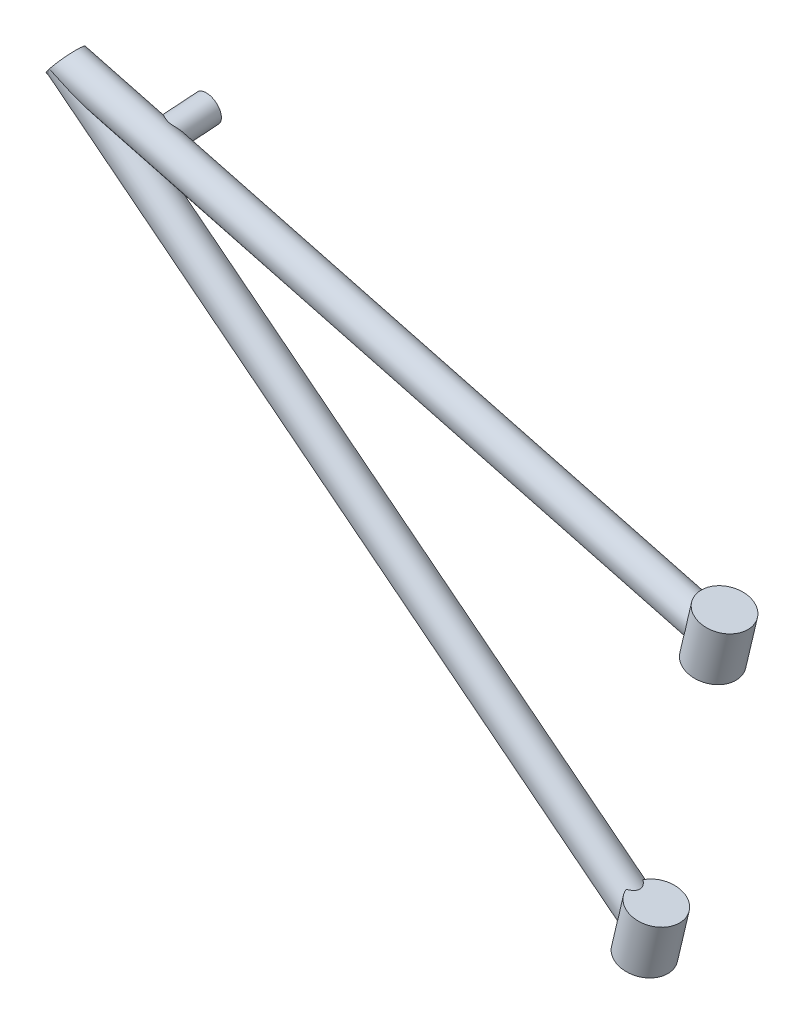
ISO-10303-21;
HEADER;
FILE_DESCRIPTION(('STEP AP214'),'2;1');
FILE_NAME('part.step','',(''),(''),'','','');
FILE_SCHEMA(('AUTOMOTIVE_DESIGN { 1 0 10303 214 1 1 1 1 }'));
ENDSEC;
DATA;
#1=APPLICATION_CONTEXT('core data for automotive mechanical design processes');
#2=APPLICATION_PROTOCOL_DEFINITION('international standard','automotive_design',2000,#1);
#3=PRODUCT_CONTEXT('',#1,'mechanical');
#4=PRODUCT('Part','Part','',(#3));
#5=PRODUCT_RELATED_PRODUCT_CATEGORY('part','',(#4));
#6=PRODUCT_DEFINITION_FORMATION('','',#4);
#7=PRODUCT_DEFINITION_CONTEXT('part definition',#1,'design');
#8=PRODUCT_DEFINITION('design','',#6,#7);
#9=PRODUCT_DEFINITION_SHAPE('','',#8);
#10=(LENGTH_UNIT() NAMED_UNIT(*) SI_UNIT(.MILLI.,.METRE.));
#11=(NAMED_UNIT(*) PLANE_ANGLE_UNIT() SI_UNIT($,.RADIAN.));
#12=(NAMED_UNIT(*) SI_UNIT($,.STERADIAN.) SOLID_ANGLE_UNIT());
#13=UNCERTAINTY_MEASURE_WITH_UNIT(LENGTH_MEASURE(1.E-05),#10,'distance_accuracy_value','');
#14=(GEOMETRIC_REPRESENTATION_CONTEXT(3) GLOBAL_UNCERTAINTY_ASSIGNED_CONTEXT((#13)) GLOBAL_UNIT_ASSIGNED_CONTEXT((#10,
#11,#12)) REPRESENTATION_CONTEXT('',''));
#15=CARTESIAN_POINT('',(0.,0.,0.));
#16=DIRECTION('',(0.,0.,1.));
#17=DIRECTION('',(1.,0.,0.));
#18=AXIS2_PLACEMENT_3D('',#15,#16,#17);
#19=CARTESIAN_POINT('',(-215.,1151.6011,-53.649));
#20=DIRECTION('',(-0.788508643665139,0.615015858971912,-0.00310033520835739));
#21=DIRECTION('',(-0.615018814783549,-0.788512433295911,0.));
#22=AXIS2_PLACEMENT_3D('',#19,#20,#21);
#23=CYLINDRICAL_SURFACE('',#22,9.525);
#24=CARTESIAN_POINT('',(-243.39562055654,1173.74893199642,-53.7606486710474));
#25=DIRECTION('',(0.230684760062267,0.973028498209276,0.000288353283411398));
#26=DIRECTION('',(-0.973022198051878,0.230684316193179,-0.00354236655039736));
#27=AXIS2_PLACEMENT_3D('',#24,#25,#26);
#28=ELLIPSE('',#27,22.8674930535986,9.525);
#29=CARTESIAN_POINT('',(-224.286262085042,1169.21993073521,-58.5827833271125));
#30=VERTEX_POINT('',#29);
#31=CARTESIAN_POINT('',(-224.320634321341,1169.225180437,-48.7995007985225));
#32=VERTEX_POINT('',#31);
#33=EDGE_CURVE('E105',#30,#32,#28,.F.);
#34=ORIENTED_EDGE('',*,*,#33,.F.);
#35=CARTESIAN_POINT('',(-224.320634321341,1169.225180437,-48.7995007985225));
#36=CARTESIAN_POINT('',(-224.295289207423,1169.09059523989,-48.6485355594731));
#37=CARTESIAN_POINT('',(-224.269502594691,1168.95160987775,-48.5016369115154));
#38=CARTESIAN_POINT('',(-224.217460516379,1168.66584174725,-48.2158483730908));
#39=CARTESIAN_POINT('',(-224.191205277724,1168.51906268832,-48.0769547371071));
#40=CARTESIAN_POINT('',(-224.138667081962,1168.21887651433,-47.8071750004393));
#41=CARTESIAN_POINT('',(-224.112384280659,1168.06548298792,-47.6762737035536));
#42=CARTESIAN_POINT('',(-224.060117173359,1167.75254967428,-47.4219621247782));
#43=CARTESIAN_POINT('',(-224.034132907183,1167.59300907918,-47.298552833037));
#44=CARTESIAN_POINT('',(-223.957136973827,1167.10586534488,-46.9390216085571));
#45=CARTESIAN_POINT('',(-223.907125055243,1166.76998067498,-46.713809774104));
#46=CARTESIAN_POINT('',(-223.81276926608,1166.08036007492,-46.2910710180656));
#47=CARTESIAN_POINT('',(-223.768428441769,1165.72661469185,-46.0935589701565));
#48=CARTESIAN_POINT('',(-223.692482337151,1165.03900047878,-45.7430462401006));
#49=CARTESIAN_POINT('',(-223.660064521758,1164.70646741956,-45.5875949874824));
#50=CARTESIAN_POINT('',(-223.605247829181,1164.03125571281,-45.2985848887143));
#51=CARTESIAN_POINT('',(-223.582847710299,1163.68857832828,-45.1650233306261));
#52=CARTESIAN_POINT('',(-223.551264109419,1162.99483116172,-44.9203286610457));
#53=CARTESIAN_POINT('',(-223.542073917122,1162.64376573279,-44.8091841869413));
#54=CARTESIAN_POINT('',(-223.540654640744,1161.93511851939,-44.6105914566239));
#55=CARTESIAN_POINT('',(-223.548419527181,1161.57753909623,-44.5231347890997));
#56=CARTESIAN_POINT('',(-223.591728976539,1160.73355915383,-44.3483048364498));
#57=CARTESIAN_POINT('',(-223.635922136758,1160.2452175784,-44.2713397563707));
#58=CARTESIAN_POINT('',(-223.739698948793,1159.51439261035,-44.1973134032289));
#59=CARTESIAN_POINT('',(-223.780506030959,1159.27120005024,-44.1795398917238));
#60=CARTESIAN_POINT('',(-223.875854045727,1158.78678991507,-44.1590549988136));
#61=CARTESIAN_POINT('',(-223.930395042434,1158.54557234923,-44.1563436877163));
#62=CARTESIAN_POINT('',(-224.054871038112,1158.06405215677,-44.1673837542468));
#63=CARTESIAN_POINT('',(-224.12500107534,1157.82380433931,-44.181354500947));
#64=CARTESIAN_POINT('',(-224.280401330248,1157.34999089194,-44.2273617054836));
#65=CARTESIAN_POINT('',(-224.365670871451,1157.11642496401,-44.2593973562663));
#66=CARTESIAN_POINT('',(-224.550567614918,1156.65864283163,-44.3423936701185));
#67=CARTESIAN_POINT('',(-224.650187433858,1156.43442189516,-44.3933446222576));
#68=CARTESIAN_POINT('',(-224.86212569037,1155.99750936304,-44.5145483765032));
#69=CARTESIAN_POINT('',(-224.974442851189,1155.78481661139,-44.5847992389658));
#70=CARTESIAN_POINT('',(-225.191087424431,1155.40463409945,-44.7320466579948));
#71=CARTESIAN_POINT('',(-225.293959076843,1155.23524453879,-44.80631437343));
#72=CARTESIAN_POINT('',(-225.50528074953,1154.9065164519,-44.9681794158287));
#73=CARTESIAN_POINT('',(-225.613732938815,1154.74718188818,-45.0557819519947));
#74=CARTESIAN_POINT('',(-225.834357534689,1154.43893292305,-45.2438062320331));
#75=CARTESIAN_POINT('',(-225.946531105204,1154.29002182791,-45.3442320151155));
#76=CARTESIAN_POINT('',(-226.172751379729,1154.00271207689,-45.5572829491347));
#77=CARTESIAN_POINT('',(-226.286798308782,1153.8643146954,-45.6699095749595));
#78=CARTESIAN_POINT('',(-226.521059223594,1153.59087193904,-45.912967181198));
#79=CARTESIAN_POINT('',(-226.641280572878,1153.45639033468,-46.0440245602015));
#80=CARTESIAN_POINT('',(-226.880011711337,1153.19866386453,-46.3181683650363));
#81=CARTESIAN_POINT('',(-226.998521482131,1153.07541911934,-46.4612549199345));
#82=CARTESIAN_POINT('',(-227.232179016608,1152.8397918452,-46.7587406524558));
#83=CARTESIAN_POINT('',(-227.347325968949,1152.72741192273,-46.9131425290829));
#84=CARTESIAN_POINT('',(-227.57271586912,1152.51320348435,-47.2324871004078));
#85=CARTESIAN_POINT('',(-227.682958494457,1152.41137566175,-47.3974304865487));
#86=CARTESIAN_POINT('',(-227.91478883551,1152.2020582696,-47.7650609369957));
#87=CARTESIAN_POINT('',(-228.035261038146,1152.0963912512,-47.9694943631884));
#88=CARTESIAN_POINT('',(-228.265752160391,1151.89856614401,-48.3904502736869));
#89=CARTESIAN_POINT('',(-228.375770122552,1151.80640929212,-48.6069738623902));
#90=CARTESIAN_POINT('',(-228.583652833395,1151.63530590534,-49.0509046031115));
#91=CARTESIAN_POINT('',(-228.681513852451,1151.55636342192,-49.2783150656136));
#92=CARTESIAN_POINT('',(-228.863515556458,1151.41154684608,-49.7425923124705));
#93=CARTESIAN_POINT('',(-228.947656277923,1151.3456727189,-49.9794590716571));
#94=CARTESIAN_POINT('',(-229.104160202246,1151.22436656883,-50.4714355906892));
#95=CARTESIAN_POINT('',(-229.175870386422,1151.16949773997,-50.7268927878857));
#96=CARTESIAN_POINT('',(-229.30170568039,1151.07381374639,-51.2446931910341));
#97=CARTESIAN_POINT('',(-229.355830136662,1151.03299910395,-51.507036652501));
#98=CARTESIAN_POINT('',(-229.445529959469,1150.96543066709,-52.0366091980168));
#99=CARTESIAN_POINT('',(-229.481109122684,1150.93867399466,-52.3038372704605));
#100=CARTESIAN_POINT('',(-229.533094783594,1150.89922397472,-52.841176424877));
#101=CARTESIAN_POINT('',(-229.549502067782,1150.88653005032,-53.1112873881254));
#102=CARTESIAN_POINT('',(-229.562602852696,1150.87542087448,-53.6424212189688));
#103=CARTESIAN_POINT('',(-229.55999265743,1150.87650236565,-53.9034167434214));
#104=CARTESIAN_POINT('',(-229.536731293886,1150.89173055095,-54.4242151822462));
#105=CARTESIAN_POINT('',(-229.516080545401,1150.90587694106,-54.6840181242275));
#106=CARTESIAN_POINT('',(-229.457074051506,1150.94722348577,-55.2005289023706));
#107=CARTESIAN_POINT('',(-229.418719841866,1150.97442250805,-55.4572370050269));
#108=CARTESIAN_POINT('',(-229.324926596394,1151.04186428499,-55.9657687486384));
#109=CARTESIAN_POINT('',(-229.269487466396,1151.08210711153,-56.2175923626644));
#110=CARTESIAN_POINT('',(-229.142935316919,1151.17525683397,-56.7125894774502));
#111=CARTESIAN_POINT('',(-229.071954994863,1151.22805682198,-56.9558170972995));
#112=CARTESIAN_POINT('',(-228.915166201555,1151.34653272991,-57.4342155058911));
#113=CARTESIAN_POINT('',(-228.829357822413,1151.41220856983,-57.6693863446706));
#114=CARTESIAN_POINT('',(-228.644188865129,1151.55656830355,-58.1303353799106));
#115=CARTESIAN_POINT('',(-228.544822192596,1151.63525805041,-58.3561092925963));
#116=CARTESIAN_POINT('',(-228.334087726109,1151.80580566917,-58.7968231124242));
#117=CARTESIAN_POINT('',(-228.222719654651,1151.89766384557,-59.0117627688809));
#118=CARTESIAN_POINT('',(-227.985290757245,1152.09856074262,-59.4374765664712));
#119=CARTESIAN_POINT('',(-227.858833402729,1152.20811807729,-59.6477852583267));
#120=CARTESIAN_POINT('',(-227.597000050461,1152.44215985744,-60.054091947955));
#121=CARTESIAN_POINT('',(-227.461623346321,1152.56664548585,-60.2500888096738));
#122=CARTESIAN_POINT('',(-227.184445881784,1152.83104256014,-60.6264138271711));
#123=CARTESIAN_POINT('',(-227.042647077319,1152.97094932768,-60.8067467054395));
#124=CARTESIAN_POINT('',(-226.755363006274,1153.26681642774,-61.1505013351463));
#125=CARTESIAN_POINT('',(-226.609878432523,1153.42277375979,-61.3139262359179));
#126=CARTESIAN_POINT('',(-226.342824344719,1153.72371503972,-61.5966577360825));
#127=CARTESIAN_POINT('',(-226.221339018976,1153.86614781129,-61.7187655348228));
#128=CARTESIAN_POINT('',(-225.979981444149,1154.16271310562,-61.9496161814568));
#129=CARTESIAN_POINT('',(-225.860108896456,1154.31684342644,-62.0583615346306));
#130=CARTESIAN_POINT('',(-225.624229262011,1154.63663394021,-62.2616660803098));
#131=CARTESIAN_POINT('',(-225.508217755384,1154.80228022846,-62.3562419603986));
#132=CARTESIAN_POINT('',(-225.282089586541,1155.14495226779,-62.5307434214336));
#133=CARTESIAN_POINT('',(-225.17197291344,1155.32197799786,-62.6106690294297));
#134=CARTESIAN_POINT('',(-224.959190023712,1155.68761446855,-62.7557996087947));
#135=CARTESIAN_POINT('',(-224.856564468665,1155.87627946014,-62.8209277883119));
#136=CARTESIAN_POINT('',(-224.661237833143,1156.26318881536,-62.9357724147125));
#137=CARTESIAN_POINT('',(-224.568536377274,1156.46143281624,-62.9854894446814));
#138=CARTESIAN_POINT('',(-224.394434085732,1156.86594068026,-63.0696863707433));
#139=CARTESIAN_POINT('',(-224.313032947956,1157.07220432882,-63.1041666742283));
#140=CARTESIAN_POINT('',(-224.162300581922,1157.49097492688,-63.1584073059781));
#141=CARTESIAN_POINT('',(-224.092970598108,1157.70348251746,-63.1781661172562));
#142=CARTESIAN_POINT('',(-223.957854047408,1158.16246560266,-63.2055004800131));
#143=CARTESIAN_POINT('',(-223.893867153004,1158.40959214042,-63.2110259573232));
#144=CARTESIAN_POINT('',(-223.781156826037,1158.90708309515,-63.2054279177171));
#145=CARTESIAN_POINT('',(-223.732435891857,1159.15744803513,-63.1943016773491));
#146=CARTESIAN_POINT('',(-223.648963411181,1159.65993837552,-63.1568028848643));
#147=CARTESIAN_POINT('',(-223.614245946277,1159.91206656964,-63.1303935121607));
#148=CARTESIAN_POINT('',(-223.557424839203,1160.4159253131,-63.0636288551156));
#149=CARTESIAN_POINT('',(-223.535325708187,1160.6676556882,-63.0232685914876));
#150=CARTESIAN_POINT('',(-223.493975928202,1161.29297924496,-62.9067113291572));
#151=CARTESIAN_POINT('',(-223.481481689577,1161.66556564527,-62.8226533010995));
#152=CARTESIAN_POINT('',(-223.475960464991,1162.40411320297,-62.6287679695519));
#153=CARTESIAN_POINT('',(-223.48294217018,1162.77007132916,-62.5189291814144));
#154=CARTESIAN_POINT('',(-223.51200981016,1163.49347214513,-62.2750042212048));
#155=CARTESIAN_POINT('',(-223.534107506928,1163.8509079793,-62.1408992270475));
#156=CARTESIAN_POINT('',(-223.589746146211,1164.55514036599,-61.8491637111948));
#157=CARTESIAN_POINT('',(-223.62328825752,1164.90193582789,-61.6915307875696));
#158=CARTESIAN_POINT('',(-223.702279469123,1165.61509098963,-61.3366418506304));
#159=CARTESIAN_POINT('',(-223.748554703177,1165.98019871388,-61.137048340388));
#160=CARTESIAN_POINT('',(-223.847550102805,1166.69187765871,-60.7087468537214));
#161=CARTESIAN_POINT('',(-223.900266593298,1167.03845928863,-60.4800554761369));
#162=CARTESIAN_POINT('',(-223.981669040053,1167.54070544438,-60.1143525560349));
#163=CARTESIAN_POINT('',(-224.009158447193,1167.70500562439,-59.9888300636568));
#164=CARTESIAN_POINT('',(-224.064536974263,1168.02720420642,-59.7299166212185));
#165=CARTESIAN_POINT('',(-224.092426037216,1168.1851035089,-59.5965267844526));
#166=CARTESIAN_POINT('',(-224.14825641266,1168.49402051598,-59.3213551888889));
#167=CARTESIAN_POINT('',(-224.176197714492,1168.64502338139,-59.179556716037));
#168=CARTESIAN_POINT('',(-224.231658194301,1168.93887124126,-58.8875319299619));
#169=CARTESIAN_POINT('',(-224.259177152742,1169.08171209155,-58.7373014108564));
#170=CARTESIAN_POINT('',(-224.286262085042,1169.21993073521,-58.5827833271127));
#171=B_SPLINE_CURVE_WITH_KNOTS('',3,(#35,#36,#37,#38,#39,#40,#41,#42,#43,#44,#45,#46,#47,#48,
#49,#50,#51,#52,#53,#54,#55,#56,#57,#58,#59,#60,#61,#62,#63,#64,#65,#66,#67,#68,#69,#70,#71,#72,
#73,#74,#75,#76,#77,#78,#79,#80,#81,#82,#83,#84,#85,#86,#87,#88,#89,#90,#91,#92,#93,#94,#95,#96,
#97,#98,#99,#100,#101,#102,#103,#104,#105,#106,#107,#108,#109,#110,#111,#112,#113,#114,#115,
#116,#117,#118,#119,#120,#121,#122,#123,#124,#125,#126,#127,#128,#129,#130,#131,#132,#133,#134,
#135,#136,#137,#138,#139,#140,#141,#142,#143,#144,#145,#146,#147,#148,#149,#150,#151,#152,#153,
#154,#155,#156,#157,#158,#159,#160,#161,#162,#163,#164,#165,#166,#167,#168,#169,#170),
.UNSPECIFIED.,.F.,.F.,(4,2,2,2,2,2,2,2,2,2,2,2,2,2,2,2,2,2,2,2,2,2,2,2,2,2,2,2,2,2,2,2,2,2,2,2,
2,2,2,2,2,2,2,2,2,2,2,2,2,2,2,2,2,2,2,2,2,2,2,2,2,2,2,2,2,2,2,4),(0.,0.611321113095376,
1.22235382943905,1.83218605530833,2.44209870234837,3.66289333627039,4.88434099855855,
5.98894252437587,7.09340709627885,8.19731043031255,9.3008212635092,10.7844934193154,
11.5255072719039,12.2665245834172,13.0173945439191,13.768230961792,14.5186824394653,
15.2690585242177,15.9032452299517,16.5376803173906,17.1723157415739,17.8070279688856,
18.4752867183987,19.1435526389086,19.8119784806388,20.4804482111198,21.258843318667,
22.0373096468022,22.8160142137426,23.5947167082833,24.4065344178047,25.2183822925516,
26.0300638965936,26.8417122016529,27.6237962912563,28.4058621827748,29.187860243073,
29.9698626134919,30.7454316380735,31.5209958450602,32.2969098201376,33.0728417402573,
33.8781372588605,34.68349663142,35.48861234955,36.2935778332745,36.9634458938148,
37.6331881707952,38.3021353757178,38.9710813454979,39.6434233396011,40.3157398923393,
40.9880384679274,41.6604063114264,42.4252747618273,43.1902683230497,43.9571126486431,
44.7242309558051,45.8689446439775,47.0141692429462,48.1602859732013,49.3065197888623,
50.5611680159512,51.8151037127785,52.4406454213905,53.066098822063,53.6928400783569,
54.319896778774),.UNSPECIFIED.);
#172=EDGE_CURVE('E92',#32,#30,#171,.T.);
#173=ORIENTED_EDGE('',*,*,#172,.F.);
#174=EDGE_LOOP('',(#34,#173));
#175=FACE_BOUND('',#174,.T.);
#176=CARTESIAN_POINT('',(-558.599999999999,1419.6,-55.));
#177=DIRECTION('',(-0.897008226583714,0.442000857679935,-0.00338869463695132));
#178=DIRECTION('',(0.441999884452041,0.897014466927656,0.00107157215105032));
#179=AXIS2_PLACEMENT_3D('',#176,#177,#178);
#180=ELLIPSE('',#179,9.72785711197768,9.525);
#181=CARTESIAN_POINT('',(-558.566535399132,1419.59488894593,-64.5249398422045));
#182=VERTEX_POINT('',#181);
#183=CARTESIAN_POINT('',(-558.633464600869,1419.60511105407,-45.4750601577955));
#184=VERTEX_POINT('',#183);
#185=EDGE_CURVE('E99',#182,#184,#180,.T.);
#186=ORIENTED_EDGE('',*,*,#185,.F.);
#187=CARTESIAN_POINT('',(-558.599999999999,1419.6,-55.));
#188=DIRECTION('',(0.441999884452041,0.897014466927656,0.00107157215105032));
#189=DIRECTION('',(-0.897008226583714,0.442000857679935,-0.00338869463695132));
#190=AXIS2_PLACEMENT_3D('',#187,#188,#189);
#191=ELLIPSE('',#190,46.8855974220386,9.525);
#192=EDGE_CURVE('E127',#184,#182,#191,.T.);
#193=ORIENTED_EDGE('',*,*,#192,.F.);
#194=EDGE_LOOP('',(#186,#193));
#195=FACE_BOUND('',#194,.T.);
#196=ADVANCED_FACE('F73',(#175,#195),#23,.T.);
#197=CARTESIAN_POINT('',(-175.,1320.3211,-53.599));
#198=DIRECTION('',(-0.968096795715719,0.250551577091192,-0.00353572369863849));
#199=DIRECTION('',(-0.250553143221362,-0.968102847027058,0.));
#200=AXIS2_PLACEMENT_3D('',#197,#198,#199);
#201=CYLINDRICAL_SURFACE('',#200,9.525);
#202=CARTESIAN_POINT('',(-504.227133417646,1414.08844154874,-59.5039585938913));
#203=CARTESIAN_POINT('',(-503.961927123941,1414.07820754271,-59.4032469761624));
#204=CARTESIAN_POINT('',(-503.691484558767,1414.05585663008,-59.3166747527512));
#205=CARTESIAN_POINT('',(-503.281428231514,1414.00317774549,-59.2171310094701));
#206=CARTESIAN_POINT('',(-503.14417939782,1413.9824626223,-59.1890179558352));
#207=CARTESIAN_POINT('',(-502.868912772925,1413.93462075802,-59.1440588380052));
#208=CARTESIAN_POINT('',(-502.730895016135,1413.90749430164,-59.1272122736244));
#209=CARTESIAN_POINT('',(-502.454160062542,1413.84669312306,-59.1055871376642));
#210=CARTESIAN_POINT('',(-502.315446324073,1413.81296686864,-59.1009079698098));
#211=CARTESIAN_POINT('',(-502.039801352501,1413.73940752968,-59.1041463012735));
#212=CARTESIAN_POINT('',(-501.902870095965,1413.69957452551,-59.1120636348316));
#213=CARTESIAN_POINT('',(-501.631836335023,1413.61416591556,-59.1400454652514));
#214=CARTESIAN_POINT('',(-501.497739029262,1413.56858067263,-59.1601305674611));
#215=CARTESIAN_POINT('',(-501.233546753294,1413.47219078627,-59.2114065512569));
#216=CARTESIAN_POINT('',(-501.103454377615,1413.42138284816,-59.2426044741843));
#217=CARTESIAN_POINT('',(-500.817381363254,1413.30228534635,-59.32333318663));
#218=CARTESIAN_POINT('',(-500.662667236592,1413.23272415921,-59.3754656061685));
#219=CARTESIAN_POINT('',(-500.361035129167,1413.08702029413,-59.4917578288162));
#220=CARTESIAN_POINT('',(-500.214121697124,1413.01087384277,-59.5559245526234));
#221=CARTESIAN_POINT('',(-499.927824303932,1412.85229270525,-59.6937845262637));
#222=CARTESIAN_POINT('',(-499.788461691683,1412.76984163245,-59.7675029729412));
#223=CARTESIAN_POINT('',(-499.517535748657,1412.59913856928,-59.9220418409785));
#224=CARTESIAN_POINT('',(-499.385971286691,1412.51088742419,-60.0028612280412));
#225=CARTESIAN_POINT('',(-499.057344819478,1412.27668947436,-60.2173804949001));
#226=CARTESIAN_POINT('',(-498.865759255915,1412.12656183872,-60.3549339422933));
#227=CARTESIAN_POINT('',(-498.500198439612,1411.81235662714,-60.6374172225113));
#228=CARTESIAN_POINT('',(-498.326232658024,1411.64827163496,-60.7823509602209));
#229=CARTESIAN_POINT('',(-497.995701337585,1411.30603420226,-61.0754021565897));
#230=CARTESIAN_POINT('',(-497.839135418213,1411.12788206951,-61.2235195455405));
#231=CARTESIAN_POINT('',(-497.543746701183,1410.75734011936,-61.519511674103));
#232=CARTESIAN_POINT('',(-497.40491803097,1410.56495504776,-61.6673864779409));
#233=CARTESIAN_POINT('',(-497.164458752496,1410.19450352679,-61.93888183558));
#234=CARTESIAN_POINT('',(-497.060349954534,1410.01835825115,-62.0629314529889));
#235=CARTESIAN_POINT('',(-496.866552599005,1409.65552671935,-62.3068882567441));
#236=CARTESIAN_POINT('',(-496.776864294558,1409.46884027822,-62.4267953703485));
#237=CARTESIAN_POINT('',(-496.613109589761,1409.08547403816,-62.6604379403582));
#238=CARTESIAN_POINT('',(-496.539018454299,1408.88881068557,-62.7741829530039));
#239=CARTESIAN_POINT('',(-496.407534560409,1408.48574170579,-62.9938008500389));
#240=CARTESIAN_POINT('',(-496.350137848579,1408.2793383986,-63.0996755937564));
#241=CARTESIAN_POINT('',(-496.263177930062,1407.90036306387,-63.281153506098));
#242=CARTESIAN_POINT('',(-496.230332705548,1407.72939706921,-63.3585469044521));
#243=CARTESIAN_POINT('',(-496.176806895916,1407.38250662678,-63.5060588223935));
#244=CARTESIAN_POINT('',(-496.156123730732,1407.206583239,-63.5761788823507));
#245=CARTESIAN_POINT('',(-496.127559145276,1406.85068522405,-63.7081294707323));
#246=CARTESIAN_POINT('',(-496.11967337962,1406.67071199308,-63.7699628063861));
#247=CARTESIAN_POINT('',(-496.11722149898,1406.30774858237,-63.884419277887));
#248=CARTESIAN_POINT('',(-496.12265555036,1406.12475836498,-63.9370422986894));
#249=CARTESIAN_POINT('',(-496.147278568362,1405.75600769714,-64.0325099269428));
#250=CARTESIAN_POINT('',(-496.16654694908,1405.57023734375,-64.0752961871487));
#251=CARTESIAN_POINT('',(-496.219066926378,1405.19847880508,-64.1500123680187));
#252=CARTESIAN_POINT('',(-496.252318549437,1405.01249061939,-64.1819422681245));
#253=CARTESIAN_POINT('',(-496.332666248085,1404.6419515399,-64.2344836351589));
#254=CARTESIAN_POINT('',(-496.379759327309,1404.4574003439,-64.2550975489777));
#255=CARTESIAN_POINT('',(-496.48738419674,1404.0913254415,-64.2848269734543));
#256=CARTESIAN_POINT('',(-496.54791514245,1403.90980154562,-64.2939432064388));
#257=CARTESIAN_POINT('',(-496.675572934044,1403.56785839932,-64.3004575799719));
#258=CARTESIAN_POINT('',(-496.741577241765,1403.40703628937,-64.2988585382038));
#259=CARTESIAN_POINT('',(-496.883492456863,1403.09012714326,-64.2865185926205));
#260=CARTESIAN_POINT('',(-496.959406645365,1402.93404169657,-64.2757746544307));
#261=CARTESIAN_POINT('',(-497.120362142021,1402.62760205586,-64.2455516208186));
#262=CARTESIAN_POINT('',(-497.205400615928,1402.47724610166,-64.2260752319886));
#263=CARTESIAN_POINT('',(-497.383869855733,1402.18288180858,-64.1789076843753));
#264=CARTESIAN_POINT('',(-497.477303771753,1402.03887588281,-64.1512134330509));
#265=CARTESIAN_POINT('',(-497.677143584659,1401.75002878118,-64.0864737670802));
#266=CARTESIAN_POINT('',(-497.78398140469,1401.60558353519,-64.0489952023888));
#267=CARTESIAN_POINT('',(-498.005217750203,1401.32488810734,-63.966349763826));
#268=CARTESIAN_POINT('',(-498.119619231033,1401.18864116898,-63.9211798737338));
#269=CARTESIAN_POINT('',(-498.472956711241,1400.79267167679,-63.7753176361167));
#270=CARTESIAN_POINT('',(-498.722077907913,1400.54564589365,-63.6642553058701));
#271=CARTESIAN_POINT('',(-499.173869484291,1400.14676267996,-63.4528857337849));
#272=CARTESIAN_POINT('',(-499.371805921152,1399.98684864708,-63.3572733286703));
#273=CARTESIAN_POINT('',(-499.777718387453,1399.68640753138,-63.1572151249142));
#274=CARTESIAN_POINT('',(-499.98569481688,1399.54588122181,-63.0527689742164));
#275=CARTESIAN_POINT('',(-500.410985486451,1399.28395395399,-62.8374523645661));
#276=CARTESIAN_POINT('',(-500.628321925971,1399.16260205729,-62.726566387582));
#277=CARTESIAN_POINT('',(-501.071112009725,1398.93955480387,-62.501442101248));
#278=CARTESIAN_POINT('',(-501.296563626799,1398.83785457806,-62.3872046303979));
#279=CARTESIAN_POINT('',(-501.721742942239,1398.66790533256,-62.1753107292589));
#280=CARTESIAN_POINT('',(-501.920399880763,1398.59693837117,-62.0776772272213));
#281=CARTESIAN_POINT('',(-502.323598655213,1398.47006325129,-61.8846336487126));
#282=CARTESIAN_POINT('',(-502.528141598473,1398.41415794712,-61.7892239968065));
#283=CARTESIAN_POINT('',(-502.942770810755,1398.31840488289,-61.6038441977512));
#284=CARTESIAN_POINT('',(-503.15284145514,1398.27851615892,-61.5138606807601));
#285=CARTESIAN_POINT('',(-503.57898994815,1398.21591324764,-61.3429314742229));
#286=CARTESIAN_POINT('',(-503.795063509686,1398.19318711446,-61.2619795318368));
#287=CARTESIAN_POINT('',(-504.2755298007,1398.16415130293,-61.0996286955312));
#288=CARTESIAN_POINT('',(-504.541231969997,1398.1618331767,-61.0211304132395));
#289=CARTESIAN_POINT('',(-504.943663710538,1398.18121611065,-60.9257565050039));
#290=CARTESIAN_POINT('',(-505.078361845688,1398.19147249697,-60.8977055209302));
#291=CARTESIAN_POINT('',(-505.348410923892,1398.21994082039,-60.8502369288314));
#292=CARTESIAN_POINT('',(-505.483761489137,1398.23814859851,-60.8308148181629));
#293=CARTESIAN_POINT('',(-505.755584486533,1398.28295660696,-60.8014365021368));
#294=CARTESIAN_POINT('',(-505.892053917192,1398.30964228831,-60.7915810139545));
#295=CARTESIAN_POINT('',(-506.163468489576,1398.37129821769,-60.7822729559632));
#296=CARTESIAN_POINT('',(-506.298413719417,1398.40626798421,-60.7828197816798));
#297=CARTESIAN_POINT('',(-506.565620812671,1398.48419333092,-60.7943121568932));
#298=CARTESIAN_POINT('',(-506.697880753283,1398.52715442412,-60.8052649067224));
#299=CARTESIAN_POINT('',(-506.958545812225,1398.62049154402,-60.8369794451697));
#300=CARTESIAN_POINT('',(-507.086950326462,1398.6708687255,-60.8577427625287));
#301=CARTESIAN_POINT('',(-507.360576290051,1398.7875109475,-60.9123233614844));
#302=CARTESIAN_POINT('',(-507.504941809906,1398.85502084152,-60.947760631104));
#303=CARTESIAN_POINT('',(-507.786723295454,1398.99822139765,-61.0286195919488));
#304=CARTESIAN_POINT('',(-507.924133646547,1399.07391851908,-61.0740491962648));
#305=CARTESIAN_POINT('',(-508.192100621541,1399.23272869479,-61.1729114242254));
#306=CARTESIAN_POINT('',(-508.32263756464,1399.31586138067,-61.2263655024713));
#307=CARTESIAN_POINT('',(-508.576543698677,1399.48859638345,-61.3392555381301));
#308=CARTESIAN_POINT('',(-508.69991457845,1399.57819716474,-61.3986900770262));
#309=CARTESIAN_POINT('',(-509.013159462264,1399.81995535392,-61.559572084255));
#310=CARTESIAN_POINT('',(-509.197589387575,1399.97687356,-61.6644938237975));
#311=CARTESIAN_POINT('',(-509.549883976089,1400.30470957574,-61.880184682566));
#312=CARTESIAN_POINT('',(-509.717738942007,1400.47563547492,-61.9909571673222));
#313=CARTESIAN_POINT('',(-510.03782477418,1400.8308602904,-62.2144043516193));
#314=CARTESIAN_POINT('',(-510.190034923743,1401.0151764007,-62.3270813490571));
#315=CARTESIAN_POINT('',(-510.478837771606,1401.39643719044,-62.5509273772745));
#316=CARTESIAN_POINT('',(-510.615433696158,1401.59337924789,-62.6620967153713));
#317=CARTESIAN_POINT('',(-510.878264923542,1402.00809662951,-62.8847909622162));
#318=CARTESIAN_POINT('',(-511.003823698978,1402.22639962873,-62.9961345269143));
#319=CARTESIAN_POINT('',(-511.237090135725,1402.67592557337,-63.2114066585112));
#320=CARTESIAN_POINT('',(-511.344794644989,1402.9071507905,-63.315333914272));
#321=CARTESIAN_POINT('',(-511.540878688391,1403.38122255609,-63.5127617574509));
#322=CARTESIAN_POINT('',(-511.629303906874,1403.62403993242,-63.6062867305479));
#323=CARTESIAN_POINT('',(-511.785543294627,1404.12066441778,-63.7804137667111));
#324=CARTESIAN_POINT('',(-511.853367300814,1404.37446621549,-63.8610219887098));
#325=CARTESIAN_POINT('',(-511.949687376554,1404.81416268624,-63.984822126781));
#326=CARTESIAN_POINT('',(-511.98387945606,1404.99770562965,-64.0319994504374));
#327=CARTESIAN_POINT('',(-512.04058341732,1405.36856162349,-64.1177008862878));
#328=CARTESIAN_POINT('',(-512.063098337642,1405.55587367995,-64.1562272481073));
#329=CARTESIAN_POINT('',(-512.095819695937,1405.93320505228,-64.2237184937059));
#330=CARTESIAN_POINT('',(-512.106031689832,1406.12322310688,-64.2526876891447));
#331=CARTESIAN_POINT('',(-512.113621667887,1406.50483120934,-64.300277465466));
#332=CARTESIAN_POINT('',(-512.110999334519,1406.69642129597,-64.3188977903004));
#333=CARTESIAN_POINT('',(-512.09245883073,1407.08097555313,-64.3452028837394));
#334=CARTESIAN_POINT('',(-512.076454789135,1407.27394059744,-64.3528161561705));
#335=CARTESIAN_POINT('',(-512.030838663479,1407.65837784541,-64.3564021081546));
#336=CARTESIAN_POINT('',(-512.001226596723,1407.84985005097,-64.3523748025114));
#337=CARTESIAN_POINT('',(-511.928461711406,1408.22952607471,-64.3324651504547));
#338=CARTESIAN_POINT('',(-511.88531278999,1408.41773081712,-64.3165862142112));
#339=CARTESIAN_POINT('',(-511.785803222786,1408.78921111574,-64.2730483480281));
#340=CARTESIAN_POINT('',(-511.729443555084,1408.97248703574,-64.245390290057));
#341=CARTESIAN_POINT('',(-511.610317720113,1409.3146885118,-64.1819664351346));
#342=CARTESIAN_POINT('',(-511.548737405783,1409.47422899074,-64.1472737842225));
#343=CARTESIAN_POINT('',(-511.415898547691,1409.78705301646,-64.0690577044582));
#344=CARTESIAN_POINT('',(-511.344636755489,1409.94033444058,-64.0255313091766));
#345=CARTESIAN_POINT('',(-511.193159777949,1410.23968111144,-63.930253965106));
#346=CARTESIAN_POINT('',(-511.112946933425,1410.38574823046,-63.8785051650859));
#347=CARTESIAN_POINT('',(-510.944269677241,1410.67009379871,-63.7674440086333));
#348=CARTESIAN_POINT('',(-510.855802149925,1410.80836927522,-63.7081287931972));
#349=CARTESIAN_POINT('',(-510.667668068888,1411.08201852401,-63.5801596077581));
#350=CARTESIAN_POINT('',(-510.567693412512,1411.21704918806,-63.511225102096));
#351=CARTESIAN_POINT('',(-510.360481322639,1411.47777509575,-63.3668677529105));
#352=CARTESIAN_POINT('',(-510.253241067036,1411.60346667169,-63.2914423850963));
#353=CARTESIAN_POINT('',(-509.921832347022,1411.96616312229,-63.0567697463922));
#354=CARTESIAN_POINT('',(-509.687859826135,1412.18895646603,-62.8890461673847));
#355=CARTESIAN_POINT('',(-509.264019314935,1412.54232189657,-62.5845379338538));
#356=CARTESIAN_POINT('',(-509.078793344922,1412.68171940469,-62.4512595915443));
#357=CARTESIAN_POINT('',(-508.69862780151,1412.94028231658,-62.1788030036918));
#358=CARTESIAN_POINT('',(-508.503684306866,1413.059439466,-62.039622379879));
#359=CARTESIAN_POINT('',(-508.104567408949,1413.27830699487,-61.7574643519054));
#360=CARTESIAN_POINT('',(-507.900362778298,1413.37794445373,-61.6144748955416));
#361=CARTESIAN_POINT('',(-507.484054264478,1413.55771101983,-61.3278444495266));
#362=CARTESIAN_POINT('',(-507.271951723088,1413.63784342351,-61.1842035741539));
#363=CARTESIAN_POINT('',(-506.836757123675,1413.78001077804,-60.8970204519231));
#364=CARTESIAN_POINT('',(-506.613547840832,1413.84175577086,-60.7535121040429));
#365=CARTESIAN_POINT('',(-506.158787070461,1413.94560119909,-60.4724011085212));
#366=CARTESIAN_POINT('',(-505.927231398137,1413.98769162806,-60.3348015014089));
#367=CARTESIAN_POINT('',(-505.456216384261,1414.05169577761,-60.0709132669445));
#368=CARTESIAN_POINT('',(-505.21679367647,1414.07369219487,-59.9445802287588));
#369=CARTESIAN_POINT('',(-504.728875117815,1414.09693771578,-59.7092015406637));
#370=CARTESIAN_POINT('',(-504.480391816321,1414.09821449923,-59.6001330197604));
#371=CARTESIAN_POINT('',(-504.227133417646,1414.08844154874,-59.5039585938913));
#372=B_SPLINE_CURVE_WITH_KNOTS('',3,(#202,#203,#204,#205,#206,#207,#208,#209,#210,#211,#212,
#213,#214,#215,#216,#217,#218,#219,#220,#221,#222,#223,#224,#225,#226,#227,#228,#229,#230,#231,
#232,#233,#234,#235,#236,#237,#238,#239,#240,#241,#242,#243,#244,#245,#246,#247,#248,#249,#250,
#251,#252,#253,#254,#255,#256,#257,#258,#259,#260,#261,#262,#263,#264,#265,#266,#267,#268,#269,
#270,#271,#272,#273,#274,#275,#276,#277,#278,#279,#280,#281,#282,#283,#284,#285,#286,#287,#288,
#289,#290,#291,#292,#293,#294,#295,#296,#297,#298,#299,#300,#301,#302,#303,#304,#305,#306,#307,
#308,#309,#310,#311,#312,#313,#314,#315,#316,#317,#318,#319,#320,#321,#322,#323,#324,#325,#326,
#327,#328,#329,#330,#331,#332,#333,#334,#335,#336,#337,#338,#339,#340,#341,#342,#343,#344,#345,
#346,#347,#348,#349,#350,#351,#352,#353,#354,#355,#356,#357,#358,#359,#360,#361,#362,#363,#364,
#365,#366,#367,#368,#369,#370,#371),.UNSPECIFIED.,.T.,.F.,(4,2,2,2,2,2,2,2,2,2,2,2,2,2,2,2,2,2,
2,2,2,2,2,2,2,2,2,2,2,2,2,2,2,2,2,2,2,2,2,2,2,2,2,2,2,2,2,2,2,2,2,2,2,2,2,2,2,2,2,2,2,2,2,2,2,2,
2,2,2,2,2,2,2,2,2,2,2,2,2,2,2,2,2,2,4),(0.,0.850776096855631,1.27513858786855,1.699482237685,
2.1272819019824,2.5550759368258,2.98359644683687,3.41238896179873,3.94393164217606,
4.47578094513749,5.00906293902172,5.54226738536875,6.37980651257597,7.21779347874712,
8.05576211522282,8.89345258910613,9.61064297423722,10.3278459467565,11.0439028131328,
11.7597899719535,12.3308101473093,12.901709142288,13.4724142467166,14.0431264792296,
14.6171412726305,15.1911571530133,15.7650488632558,16.3389045177163,16.8598561009323,
17.3809806088792,17.9019437076634,18.4231031041383,18.9731425031051,19.5233981037444,
20.6236338921804,21.4381985785334,22.2527957435073,23.0694445952816,23.8858908458619,
24.5827152734311,25.279671662883,25.9748339892603,26.6695120067462,27.4976183908397,
27.9111139444188,28.324393477211,28.7419782798461,29.1595388168688,29.5773884936187,
29.9953033036692,30.4843245931758,30.9737345498277,31.4644771210677,31.955103565315,
32.7456223728925,33.5366009717481,34.3286138353776,35.1204627543428,35.9455847778471,
36.7708523161029,37.5941425126151,38.4170389743137,38.9942251296996,39.5712610173794,
40.1480362215705,40.7248256954886,41.3053451219395,41.8858638101271,42.4662155251213,
43.0465242861011,43.5694079749574,44.0924675429851,44.6153906435017,45.1385119213792,
45.6827744226348,46.2272495520153,47.3155509458201,48.1168332764753,48.9184416026508,
49.7229897025942,50.527401735701,51.3438982497446,52.1608100026551,52.9743444163764,
53.7867919224675),.UNSPECIFIED.);
#373=CARTESIAN_POINT('',(-504.227133417646,1414.08844154874,-59.5039585938913));
#374=VERTEX_POINT('',#373);
#375=EDGE_CURVE('E12',#374,#374,#372,.T.);
#376=ORIENTED_EDGE('',*,*,#375,.F.);
#377=EDGE_LOOP('',(#376));
#378=FACE_BOUND('',#377,.T.);
#379=CARTESIAN_POINT('',(-190.753939195461,1314.55952101737,-53.6478210535175));
#380=CARTESIAN_POINT('',(-190.753173276137,1314.55932352662,-53.8874819712135));
#381=CARTESIAN_POINT('',(-190.744347125622,1314.56639484963,-54.127133975741));
#382=CARTESIAN_POINT('',(-190.71075571716,1314.59498073899,-54.6044527277699));
#383=CARTESIAN_POINT('',(-190.685989540937,1314.61649613745,-54.8421193600982));
#384=CARTESIAN_POINT('',(-190.621032728392,1314.67370023612,-55.3137218601182));
#385=CARTESIAN_POINT('',(-190.580834245694,1314.70939614656,-55.547655766826));
#386=CARTESIAN_POINT('',(-190.48584676052,1314.79452200271,-56.0099791079303));
#387=CARTESIAN_POINT('',(-190.431057771031,1314.8439519362,-56.2383685472621));
#388=CARTESIAN_POINT('',(-190.308254983543,1314.95573315487,-56.6870713684654));
#389=CARTESIAN_POINT('',(-190.24030531069,1315.01802187907,-56.9074179891311));
#390=CARTESIAN_POINT('',(-190.092242541731,1315.1550712723,-57.3399734740079));
#391=CARTESIAN_POINT('',(-190.012129472565,1315.22983191371,-57.5521823562414));
#392=CARTESIAN_POINT('',(-189.84108895378,1315.39121656418,-57.9674608202499));
#393=CARTESIAN_POINT('',(-189.750163613113,1315.47783826022,-58.1705321736977));
#394=CARTESIAN_POINT('',(-189.558844298662,1315.66243521111,-58.5668985191001));
#395=CARTESIAN_POINT('',(-189.458446804482,1315.76041469027,-58.7601898349033));
#396=CARTESIAN_POINT('',(-189.240922696546,1315.97584539456,-59.1520214270591));
#397=CARTESIAN_POINT('',(-189.123099194351,1316.09423887925,-59.3496565831249));
#398=CARTESIAN_POINT('',(-188.879812171168,1316.34332315267,-59.7321832057202));
#399=CARTESIAN_POINT('',(-188.754345350303,1316.47401926633,-59.9170690934688));
#400=CARTESIAN_POINT('',(-188.497479795171,1316.74752979453,-60.2737962759467));
#401=CARTESIAN_POINT('',(-188.366072973456,1316.89036097895,-60.4456188761465));
#402=CARTESIAN_POINT('',(-188.099439552992,1317.18775611879,-60.7754449671732));
#403=CARTESIAN_POINT('',(-187.964214216859,1317.34231622385,-60.9334529567109));
#404=CARTESIAN_POINT('',(-187.670667191836,1317.68818460187,-61.2587751225514));
#405=CARTESIAN_POINT('',(-187.512026137735,1317.88146851752,-61.4237108335926));
#406=CARTESIAN_POINT('',(-187.195476461372,1318.28397071489,-61.7338255596395));
#407=CARTESIAN_POINT('',(-187.037568021286,1318.49319275592,-61.8789998908875));
#408=CARTESIAN_POINT('',(-186.726467155519,1318.92743566851,-62.148229603562));
#409=CARTESIAN_POINT('',(-186.573266845149,1319.15242779309,-62.2723220696339));
#410=CARTESIAN_POINT('',(-186.27538978657,1319.61876958345,-62.4983197574415));
#411=CARTESIAN_POINT('',(-186.130713066173,1319.8601193026,-62.600224906784));
#412=CARTESIAN_POINT('',(-185.8961508264,1320.28357772402,-62.7530015433697));
#413=CARTESIAN_POINT('',(-185.802890326575,1320.46162664385,-62.8099984758332));
#414=CARTESIAN_POINT('',(-185.624452256442,1320.82503024277,-62.9116802923861));
#415=CARTESIAN_POINT('',(-185.539269476336,1321.01038010234,-62.9563731479945));
#416=CARTESIAN_POINT('',(-185.378603479192,1321.38753946652,-63.0328474108784));
#417=CARTESIAN_POINT('',(-185.303107246393,1321.57933985649,-63.0646462706239));
#418=CARTESIAN_POINT('',(-185.163043472864,1321.96861509383,-63.1149416436986));
#419=CARTESIAN_POINT('',(-185.09847605389,1322.16609000438,-63.1334380088355));
#420=CARTESIAN_POINT('',(-184.981065993868,1322.56611441825,-63.1568806882635));
#421=CARTESIAN_POINT('',(-184.928268998185,1322.76868039991,-63.1617750672427));
#422=CARTESIAN_POINT('',(-184.835256243172,1323.17653970493,-63.1578218281094));
#423=CARTESIAN_POINT('',(-184.795040260688,1323.38183297984,-63.148974453756));
#424=CARTESIAN_POINT('',(-184.727144716963,1323.79366202198,-63.1177400358333));
#425=CARTESIAN_POINT('',(-184.69947794484,1324.00019884036,-63.0953392337324));
#426=CARTESIAN_POINT('',(-184.656210799934,1324.41270806028,-63.0374228992829));
#427=CARTESIAN_POINT('',(-184.640612905695,1324.61868033724,-63.0019046752663));
#428=CARTESIAN_POINT('',(-184.618751170142,1325.06579843923,-62.9107435297436));
#429=CARTESIAN_POINT('',(-184.614693912215,1325.3065467072,-62.8526186902304));
#430=CARTESIAN_POINT('',(-184.620178123392,1325.78329016911,-62.7199128906776));
#431=CARTESIAN_POINT('',(-184.629722539503,1326.01928432177,-62.6453283673611));
#432=CARTESIAN_POINT('',(-184.660255999537,1326.48527926654,-62.4806248191313));
#433=CARTESIAN_POINT('',(-184.681257098936,1326.71527347752,-62.3904894990802));
#434=CARTESIAN_POINT('',(-184.732559890817,1327.16784350322,-62.1956367216974));
#435=CARTESIAN_POINT('',(-184.762861319196,1327.39041952841,-62.0909196784936));
#436=CARTESIAN_POINT('',(-184.865911822417,1328.05385985535,-61.7518083902875));
#437=CARTESIAN_POINT('',(-184.950111250602,1328.48194494949,-61.4954738528022));
#438=CARTESIAN_POINT('',(-185.133822788399,1329.29758942415,-60.9292388650454));
#439=CARTESIAN_POINT('',(-185.233342425093,1329.68512872577,-60.6193120747022));
#440=CARTESIAN_POINT('',(-185.396286649879,1330.27137728801,-60.0788218089472));
#441=CARTESIAN_POINT('',(-185.458754556981,1330.4850666954,-59.8640425597593));
#442=CARTESIAN_POINT('',(-185.582426558913,1330.89268542503,-59.4159634068953));
#443=CARTESIAN_POINT('',(-185.643630396179,1331.08661075126,-59.1826597747452));
#444=CARTESIAN_POINT('',(-185.762335459443,1331.45218421076,-58.6986784073366));
#445=CARTESIAN_POINT('',(-185.819840326108,1331.62385442277,-58.4480182757927));
#446=CARTESIAN_POINT('',(-185.928984648582,1331.94260903194,-57.9303515724569));
#447=CARTESIAN_POINT('',(-185.980626347743,1332.08970284269,-57.6633513132824));
#448=CARTESIAN_POINT('',(-186.064147843548,1332.32356572651,-57.1828384878096));
#449=CARTESIAN_POINT('',(-186.097752101616,1332.41624778731,-56.9724868639357));
#450=CARTESIAN_POINT('',(-186.159676195115,1332.58513618912,-56.5445323049793));
#451=CARTESIAN_POINT('',(-186.187997152762,1332.66134602951,-56.3269309214038));
#452=CARTESIAN_POINT('',(-186.238627519419,1332.79622533821,-55.8858360715992));
#453=CARTESIAN_POINT('',(-186.260941253334,1332.85490742899,-55.662346972188));
#454=CARTESIAN_POINT('',(-186.299000364562,1332.95393421736,-55.2107718407871));
#455=CARTESIAN_POINT('',(-186.314745578389,1332.99427845854,-54.9826856945277));
#456=CARTESIAN_POINT('',(-186.339285132057,1333.05608805207,-54.5227632708627));
#457=CARTESIAN_POINT('',(-186.348054615067,1333.07748592261,-54.2909165601384));
#458=CARTESIAN_POINT('',(-186.358312459469,1333.10079576062,-53.82608160722));
#459=CARTESIAN_POINT('',(-186.359800830609,1333.10270775418,-53.593093366555));
#460=CARTESIAN_POINT('',(-186.355470246828,1333.08701359718,-53.1278233888262));
#461=CARTESIAN_POINT('',(-186.349650556795,1333.06940548314,-52.8955417251923));
#462=CARTESIAN_POINT('',(-186.33088876191,1333.01496921863,-52.4335435709002));
#463=CARTESIAN_POINT('',(-186.31794682275,1332.97814151529,-52.2038270206933));
#464=CARTESIAN_POINT('',(-186.286194495221,1332.88832829191,-51.760774671337));
#465=CARTESIAN_POINT('',(-186.267732647408,1332.83630579613,-51.5472172471947));
#466=CARTESIAN_POINT('',(-186.225230658051,1332.71626929353,-51.1251439688765));
#467=CARTESIAN_POINT('',(-186.201188587855,1332.64824975766,-50.9166298853708));
#468=CARTESIAN_POINT('',(-186.14811517242,1332.49710320011,-50.5058861719436));
#469=CARTESIAN_POINT('',(-186.119085164448,1332.41398022732,-50.3036548747222));
#470=CARTESIAN_POINT('',(-186.056683514999,1332.23351841698,-49.9062611522535));
#471=CARTESIAN_POINT('',(-186.023310282131,1332.1361743671,-49.7111013517311));
#472=CARTESIAN_POINT('',(-185.94999474642,1331.91950850595,-49.31256926022));
#473=CARTESIAN_POINT('',(-185.90973605236,1331.79902700764,-49.1098859830114));
#474=CARTESIAN_POINT('',(-185.825943032636,1331.54367220568,-48.7144141817806));
#475=CARTESIAN_POINT('',(-185.782407331804,1331.40879285005,-48.5216298695031));
#476=CARTESIAN_POINT('',(-185.693090061034,1331.12577289579,-48.1465066033552));
#477=CARTESIAN_POINT('',(-185.647307670951,1330.9776274379,-47.9641715173833));
#478=CARTESIAN_POINT('',(-185.554587160773,1330.66915883348,-47.6104135050218));
#479=CARTESIAN_POINT('',(-185.507648909479,1330.50883430017,-47.4389918253873));
#480=CARTESIAN_POINT('',(-185.405529917009,1330.14791834102,-47.0783761657935));
#481=CARTESIAN_POINT('',(-185.350343687659,1329.94518910973,-46.8913190550529));
#482=CARTESIAN_POINT('',(-185.241881973975,1329.52557208121,-46.5331748294722));
#483=CARTESIAN_POINT('',(-185.188606785969,1329.30868210278,-46.3620901848025));
#484=CARTESIAN_POINT('',(-185.086072541563,1328.86182620662,-46.0363044005713));
#485=CARTESIAN_POINT('',(-185.036815828541,1328.63185279007,-45.8816128051318));
#486=CARTESIAN_POINT('',(-184.944722130874,1328.16006584648,-45.5893457115036));
#487=CARTESIAN_POINT('',(-184.901884218953,1327.91825403634,-45.4517677415229));
#488=CARTESIAN_POINT('',(-184.830045775968,1327.4547018407,-45.2105447246641));
#489=CARTESIAN_POINT('',(-184.799986241843,1327.23421384418,-45.1048075479443));
#490=CARTESIAN_POINT('',(-184.748774030131,1326.78584712572,-44.9077432078227));
#491=CARTESIAN_POINT('',(-184.727621306168,1326.55796844227,-44.8164159693926));
#492=CARTESIAN_POINT('',(-184.696347198844,1326.09626942506,-44.6491714394377));
#493=CARTESIAN_POINT('',(-184.68620802866,1325.86245929749,-44.573229462681));
#494=CARTESIAN_POINT('',(-184.67903132957,1325.38996819197,-44.4375771914747));
#495=CARTESIAN_POINT('',(-184.681990869216,1325.15128831575,-44.3778632684163));
#496=CARTESIAN_POINT('',(-184.701113937431,1324.71315583905,-44.2846885314263));
#497=CARTESIAN_POINT('',(-184.714864220245,1324.51418526346,-44.2484577267921));
#498=CARTESIAN_POINT('',(-184.753454086789,1324.11547586847,-44.1882676646681));
#499=CARTESIAN_POINT('',(-184.778291442209,1323.91573721144,-44.1643059433826));
#500=CARTESIAN_POINT('',(-184.839575239762,1323.51707439087,-44.1290913982558));
#501=CARTESIAN_POINT('',(-184.876012305947,1323.3181497005,-44.1178283434682));
#502=CARTESIAN_POINT('',(-184.960610702788,1322.92248327026,-44.1082216390922));
#503=CARTESIAN_POINT('',(-185.0087722333,1322.72574156767,-44.1098782097471));
#504=CARTESIAN_POINT('',(-185.116448777112,1322.3359358264,-44.1261293389288));
#505=CARTESIAN_POINT('',(-185.175963949373,1322.14287183925,-44.1407240786109));
#506=CARTESIAN_POINT('',(-185.305526466112,1321.76174113289,-44.1826384041491));
#507=CARTESIAN_POINT('',(-185.375573741006,1321.57367438066,-44.2099579059361));
#508=CARTESIAN_POINT('',(-185.525107495252,1321.20339231672,-44.2769538630643));
#509=CARTESIAN_POINT('',(-185.60460312216,1321.02118289626,-44.3166423549069));
#510=CARTESIAN_POINT('',(-185.771633917045,1320.66344516805,-44.4078651697605));
#511=CARTESIAN_POINT('',(-185.859173660085,1320.48792074366,-44.4594062592457));
#512=CARTESIAN_POINT('',(-186.067552294938,1320.09342535133,-44.5906059998254));
#513=CARTESIAN_POINT('',(-186.190604764323,1319.87688487849,-44.6740750180193));
#514=CARTESIAN_POINT('',(-186.444530514028,1319.45626849778,-44.858702392554));
#515=CARTESIAN_POINT('',(-186.575406603965,1319.25219712167,-44.9598671292057));
#516=CARTESIAN_POINT('',(-186.84216519874,1318.85635167945,-45.1789295170187));
#517=CARTESIAN_POINT('',(-186.978053010163,1318.6645912736,-45.2968453046592));
#518=CARTESIAN_POINT('',(-187.252036303826,1318.29345418746,-45.5484468412848));
#519=CARTESIAN_POINT('',(-187.390131649517,1318.11407674484,-45.6821316181053));
#520=CARTESIAN_POINT('',(-187.668826468743,1317.76414398747,-45.9673274821298));
#521=CARTESIAN_POINT('',(-187.809422639033,1317.5938268329,-46.119133685765));
#522=CARTESIAN_POINT('',(-188.088158414499,1317.26570662138,-46.4378804637019));
#523=CARTESIAN_POINT('',(-188.226297392594,1317.10790672432,-46.6048248368548));
#524=CARTESIAN_POINT('',(-188.497931510532,1316.80490108163,-46.9533357011089));
#525=CARTESIAN_POINT('',(-188.631426199408,1316.65969655701,-47.13490360653));
#526=CARTESIAN_POINT('',(-188.891690618255,1316.38211379078,-47.5121778541811));
#527=CARTESIAN_POINT('',(-189.018459351595,1316.24973744763,-47.7078862816179));
#528=CARTESIAN_POINT('',(-189.279745979003,1315.98125583595,-48.1402327111003));
#529=CARTESIAN_POINT('',(-189.413000394817,1315.84705882036,-48.3788297547625));
#530=CARTESIAN_POINT('',(-189.665179366286,1315.59667697649,-48.8723600257526));
#531=CARTESIAN_POINT('',(-189.784110343366,1315.48048406993,-49.1272858535176));
#532=CARTESIAN_POINT('',(-190.004688346199,1315.26725911924,-49.6518284776941));
#533=CARTESIAN_POINT('',(-190.106355604091,1315.17020462412,-49.9214275813983));
#534=CARTESIAN_POINT('',(-190.289791434439,1314.99633830584,-50.473574235218));
#535=CARTESIAN_POINT('',(-190.371568114587,1314.91951823377,-50.7561164535332));
#536=CARTESIAN_POINT('',(-190.493594140676,1314.80528196961,-51.2532766092158));
#537=CARTESIAN_POINT('',(-190.53908902951,1314.7628311576,-51.4654743048959));
#538=CARTESIAN_POINT('',(-190.617480225738,1314.68968177169,-51.8941629273531));
#539=CARTESIAN_POINT('',(-190.650379035156,1314.65898086384,-52.1106529925198));
#540=CARTESIAN_POINT('',(-190.702969572811,1314.60966175048,-52.546501385509));
#541=CARTESIAN_POINT('',(-190.722667061322,1314.59103827521,-52.7658584197033));
#542=CARTESIAN_POINT('',(-190.748505451264,1314.56605831575,-53.2060864141235));
#543=CARTESIAN_POINT('',(-190.754645041248,1314.55970301827,-53.4269575187319));
#544=CARTESIAN_POINT('',(-190.753939195461,1314.55952101737,-53.6478210535175));
#545=B_SPLINE_CURVE_WITH_KNOTS('',3,(#379,#380,#381,#382,#383,#384,#385,#386,#387,#388,#389,
#390,#391,#392,#393,#394,#395,#396,#397,#398,#399,#400,#401,#402,#403,#404,#405,#406,#407,#408,
#409,#410,#411,#412,#413,#414,#415,#416,#417,#418,#419,#420,#421,#422,#423,#424,#425,#426,#427,
#428,#429,#430,#431,#432,#433,#434,#435,#436,#437,#438,#439,#440,#441,#442,#443,#444,#445,#446,
#447,#448,#449,#450,#451,#452,#453,#454,#455,#456,#457,#458,#459,#460,#461,#462,#463,#464,#465,
#466,#467,#468,#469,#470,#471,#472,#473,#474,#475,#476,#477,#478,#479,#480,#481,#482,#483,#484,
#485,#486,#487,#488,#489,#490,#491,#492,#493,#494,#495,#496,#497,#498,#499,#500,#501,#502,#503,
#504,#505,#506,#507,#508,#509,#510,#511,#512,#513,#514,#515,#516,#517,#518,#519,#520,#521,#522,
#523,#524,#525,#526,#527,#528,#529,#530,#531,#532,#533,#534,#535,#536,#537,#538,#539,#540,#541,
#542,#543,#544),.UNSPECIFIED.,.T.,.F.,(4,2,2,2,2,2,2,2,2,2,2,2,2,2,2,2,2,2,2,2,2,2,2,2,2,2,2,2,
2,2,2,2,2,2,2,2,2,2,2,2,2,2,2,2,2,2,2,2,2,2,2,2,2,2,2,2,2,2,2,2,2,2,2,2,2,2,2,2,2,2,2,2,2,2,2,2,
2,2,2,2,2,2,4),(0.,0.718761889194264,1.43756518875109,2.15673444055629,2.87590305219343,
3.59165189138774,4.30739914533746,5.02300701994356,5.73888191110378,6.51441922460631,
7.29029376944305,8.06725852709305,8.84396931732261,9.74155422161301,10.639351498581,
11.5355527495362,12.4317569245883,13.0579455386586,13.6837275001299,14.3086595937207,
14.9335986490664,15.5609205993016,16.1882314218648,16.8161801192703,17.4442577421181,
18.1862737774696,18.928450606119,19.6714099126252,20.4143481230415,21.9270801279758,
23.4405577502841,24.3675621714748,25.2947536497084,26.2210181283394,27.1469269985311,
27.8431599710917,28.5392448893626,29.2348273125878,29.930427047431,30.628494467083,
31.3265609519557,32.0246976601979,32.7228181275145,33.3838265046773,34.0450636825419,
34.7061238585141,35.3674269376293,36.084328300426,36.8015322001708,37.5189998886248,
38.2365493945451,39.0796230280813,39.9228268292241,40.7665188818787,41.6100889347411,
42.3485686025597,43.0870444252105,43.8243258324591,44.561442246966,45.1689467891595,
45.7763292884442,46.3832220868541,46.9901252311094,47.5970368731232,48.203944505494,
48.8114445852049,49.4192923425664,50.2061738259689,50.9933396118333,51.7813642567751,
52.5693403450419,53.3725782163624,54.176018217174,54.9795360164806,55.7831725478809,
56.6952773903345,57.6069717875684,58.517590242,59.4278368905536,60.0905809167669,
60.7531932303764,61.4155162306405,62.0779032941745),.UNSPECIFIED.);
#546=CARTESIAN_POINT('',(-190.753939195461,1314.55952101737,-53.6478210535175));
#547=VERTEX_POINT('',#546);
#548=EDGE_CURVE('E86',#547,#547,#545,.T.);
#549=ORIENTED_EDGE('',*,*,#548,.F.);
#550=EDGE_LOOP('',(#549));
#551=FACE_BOUND('',#550,.T.);
#552=CARTESIAN_POINT('',(-558.600000000001,1419.6,-55.));
#553=DIRECTION('',(-0.788508643665139,0.615015858971912,-0.00310033520835738));
#554=DIRECTION('',(-0.615013638287672,-0.788514556162628,-0.00173765353659148));
#555=AXIS2_PLACEMENT_3D('',#552,#553,#554);
#556=ELLIPSE('',#555,10.38195969076,9.525);
#557=EDGE_CURVE('E120',#182,#184,#556,.F.);
#558=ORIENTED_EDGE('',*,*,#557,.T.);
#559=ORIENTED_EDGE('',*,*,#192,.T.);
#560=EDGE_LOOP('',(#558,#559));
#561=FACE_BOUND('',#560,.T.);
#562=ADVANCED_FACE('F147',(#378,#551,#561),#201,.T.);
#563=EDGE_CURVE('E116',#184,#182,#556,.F.);
#564=ORIENTED_EDGE('',*,*,#563,.T.);
#565=ORIENTED_EDGE('',*,*,#185,.T.);
#566=EDGE_LOOP('',(#564,#565));
#567=FACE_BOUND('',#566,.T.);
#568=ADVANCED_FACE('F150',(#567),#201,.T.);
#569=CARTESIAN_POINT('',(-558.6,1419.6,-55.));
#570=DIRECTION('',(-0.788508643665139,0.615015858971912,-0.00310033520835738));
#571=DIRECTION('',(-0.615018814783548,-0.788512433295912,0.));
#572=AXIS2_PLACEMENT_3D('',#569,#570,#571);
#573=PLANE('',#572);
#574=ORIENTED_EDGE('',*,*,#563,.F.);
#575=ORIENTED_EDGE('',*,*,#557,.F.);
#576=EDGE_LOOP('',(#574,#575));
#577=FACE_BOUND('',#576,.T.);
#578=ADVANCED_FACE('F75',(#577),#573,.T.);
#579=CARTESIAN_POINT('',(-218.460272,1137.00567,-53.6533253));
#580=DIRECTION('',(0.230684760062267,0.973028498209276,0.000288353283411398));
#581=DIRECTION('',(-0.973028538661778,0.230684769652712,0.));
#582=AXIS2_PLACEMENT_3D('',#579,#580,#581);
#583=PLANE('',#582);
#584=CARTESIAN_POINT('',(-218.460272,1137.00567,-53.6533253));
#585=DIRECTION('',(0.230684760062267,0.973028498209276,0.000288353283411398));
#586=DIRECTION('',(-0.973028538661778,0.230684769652712,0.));
#587=AXIS2_PLACEMENT_3D('',#584,#585,#586);
#588=CIRCLE('',#587,14.);
#589=CARTESIAN_POINT('',(-232.082671541265,1140.23525677514,-53.6533253));
#590=VERTEX_POINT('',#589);
#591=EDGE_CURVE('E117',#590,#590,#588,.T.);
#592=ORIENTED_EDGE('',*,*,#591,.F.);
#593=EDGE_LOOP('',(#592));
#594=FACE_BOUND('',#593,.T.);
#595=ADVANCED_FACE('F143',(#594),#583,.F.);
#596=CARTESIAN_POINT('',(-211.539728,1166.19653,-53.6446747));
#597=DIRECTION('',(0.230684760062267,0.973028498209276,0.000288353283411398));
#598=DIRECTION('',(-0.973028538661778,0.230684769652712,0.));
#599=AXIS2_PLACEMENT_3D('',#596,#597,#598);
#600=PLANE('',#599);
#601=CARTESIAN_POINT('',(-211.539728,1166.19653,-53.6446747));
#602=DIRECTION('',(0.230684760062267,0.973028498209276,0.000288353283411398));
#603=DIRECTION('',(-0.973028538661778,0.230684769652712,0.));
#604=AXIS2_PLACEMENT_3D('',#601,#602,#603);
#605=CIRCLE('',#604,14.);
#606=EDGE_CURVE('E113',#32,#30,#605,.T.);
#607=ORIENTED_EDGE('',*,*,#606,.T.);
#608=ORIENTED_EDGE('',*,*,#33,.T.);
#609=EDGE_LOOP('',(#607,#608));
#610=FACE_BOUND('',#609,.T.);
#611=ADVANCED_FACE('F115',(#610),#600,.T.);
#612=CARTESIAN_POINT('',(-218.460272,1137.00567,-53.6533253));
#613=DIRECTION('',(0.230684760062267,0.973028498209276,0.000288353283411629));
#614=DIRECTION('',(-0.973028538661778,0.230684769652712,0.));
#615=AXIS2_PLACEMENT_3D('',#612,#613,#614);
#616=CYLINDRICAL_SURFACE('',#615,14.);
#617=ORIENTED_EDGE('',*,*,#606,.F.);
#618=ORIENTED_EDGE('',*,*,#172,.T.);
#619=EDGE_LOOP('',(#617,#618));
#620=FACE_BOUND('',#619,.T.);
#621=ORIENTED_EDGE('',*,*,#591,.T.);
#622=EDGE_LOOP('',(#621));
#623=FACE_BOUND('',#622,.T.);
#624=ADVANCED_FACE('F111',(#620,#623),#616,.T.);
#625=CARTESIAN_POINT('',(-178.460272,1305.72567,-53.6033253));
#626=DIRECTION('',(0.230684760062262,0.973028498209277,0.000288353283412779));
#627=DIRECTION('',(-0.973028538661779,0.230684769652707,0.));
#628=AXIS2_PLACEMENT_3D('',#625,#626,#627);
#629=PLANE('',#628);
#630=CARTESIAN_POINT('',(-178.460272,1305.72567,-53.6033253));
#631=DIRECTION('',(0.230684760062262,0.973028498209277,0.000288353283412779));
#632=DIRECTION('',(-0.973028538661779,0.230684769652707,0.));
#633=AXIS2_PLACEMENT_3D('',#630,#631,#632);
#634=CIRCLE('',#633,14.);
#635=CARTESIAN_POINT('',(-192.082671541265,1308.95525677514,-53.6033253));
#636=VERTEX_POINT('',#635);
#637=EDGE_CURVE('E308',#636,#636,#634,.T.);
#638=ORIENTED_EDGE('',*,*,#637,.F.);
#639=EDGE_LOOP('',(#638));
#640=FACE_BOUND('',#639,.T.);
#641=ADVANCED_FACE('F139',(#640),#629,.F.);
#642=CARTESIAN_POINT('',(-171.539728,1334.91653,-53.5946747));
#643=DIRECTION('',(0.230684760062262,0.973028498209277,0.000288353283412779));
#644=DIRECTION('',(-0.973028538661779,0.230684769652707,0.));
#645=AXIS2_PLACEMENT_3D('',#642,#643,#644);
#646=PLANE('',#645);
#647=CARTESIAN_POINT('',(-171.539728,1334.91653,-53.5946747));
#648=DIRECTION('',(0.230684760062262,0.973028498209277,0.000288353283412779));
#649=DIRECTION('',(-0.973028538661779,0.230684769652707,0.));
#650=AXIS2_PLACEMENT_3D('',#647,#648,#649);
#651=CIRCLE('',#650,14.);
#652=CARTESIAN_POINT('',(-185.162127541265,1338.14611677514,-53.5946747));
#653=VERTEX_POINT('',#652);
#654=EDGE_CURVE('E123',#653,#653,#651,.T.);
#655=ORIENTED_EDGE('',*,*,#654,.T.);
#656=EDGE_LOOP('',(#655));
#657=FACE_BOUND('',#656,.T.);
#658=ADVANCED_FACE('F162',(#657),#646,.T.);
#659=CARTESIAN_POINT('',(-178.460272,1305.72567,-53.6033253));
#660=DIRECTION('',(0.230684760062265,0.973028498209276,0.000288353283411627));
#661=DIRECTION('',(-0.973028538661778,0.23068476965271,0.));
#662=AXIS2_PLACEMENT_3D('',#659,#660,#661);
#663=CYLINDRICAL_SURFACE('',#662,14.);
#664=ORIENTED_EDGE('',*,*,#548,.T.);
#665=EDGE_LOOP('',(#664));
#666=FACE_BOUND('',#665,.T.);
#667=ORIENTED_EDGE('',*,*,#654,.F.);
#668=EDGE_LOOP('',(#667));
#669=FACE_BOUND('',#668,.T.);
#670=ORIENTED_EDGE('',*,*,#637,.T.);
#671=EDGE_LOOP('',(#670));
#672=FACE_BOUND('',#671,.T.);
#673=ADVANCED_FACE('F146',(#666,#669,#672),#663,.T.);
#674=CARTESIAN_POINT('',(-503.54,1408.46,-83.29));
#675=DIRECTION('',(0.0297371961792521,0.100867054716723,-0.994455396906352));
#676=DIRECTION('',(0.,0.994895387610701,0.100911682727782));
#677=AXIS2_PLACEMENT_3D('',#674,#675,#676);
#678=PLANE('',#677);
#679=CARTESIAN_POINT('',(-503.54,1408.46,-83.29));
#680=DIRECTION('',(0.0297371961792521,0.100867054716723,-0.994455396906352));
#681=DIRECTION('',(0.,0.994895387610701,0.100911682727782));
#682=AXIS2_PLACEMENT_3D('',#679,#680,#681);
#683=CIRCLE('',#682,8.00000000000002);
#684=CARTESIAN_POINT('',(-503.54,1416.41916310089,-82.4827065381777));
#685=VERTEX_POINT('',#684);
#686=EDGE_CURVE('E307',#685,#685,#683,.T.);
#687=ORIENTED_EDGE('',*,*,#686,.T.);
#688=EDGE_LOOP('',(#687));
#689=FACE_BOUND('',#688,.T.);
#690=ADVANCED_FACE('F161',(#689),#678,.T.);
#691=CARTESIAN_POINT('',(-504.391876,1405.57048,-54.8020188));
#692=DIRECTION('',(0.0297371961792444,0.100867054716708,-0.994455396906354));
#693=DIRECTION('',(0.,0.994895387610703,0.100911682727766));
#694=AXIS2_PLACEMENT_3D('',#691,#692,#693);
#695=CYLINDRICAL_SURFACE('',#694,8.00000000000002);
#696=ORIENTED_EDGE('',*,*,#375,.T.);
#697=EDGE_LOOP('',(#696));
#698=FACE_BOUND('',#697,.T.);
#699=ORIENTED_EDGE('',*,*,#686,.F.);
#700=EDGE_LOOP('',(#699));
#701=FACE_BOUND('',#700,.T.);
#702=ADVANCED_FACE('F170',(#698,#701),#695,.T.);
#703=CLOSED_SHELL('',(#196,#562,#568,#578,#595,#611,#624,#641,#658,#673,#690,#702));
#704=MANIFOLD_SOLID_BREP('B2',#703);
#705=ADVANCED_BREP_SHAPE_REPRESENTATION('',(#18,#704),#14);
#706=SHAPE_DEFINITION_REPRESENTATION(#9,#705);
ENDSEC;
END-ISO-10303-21;
